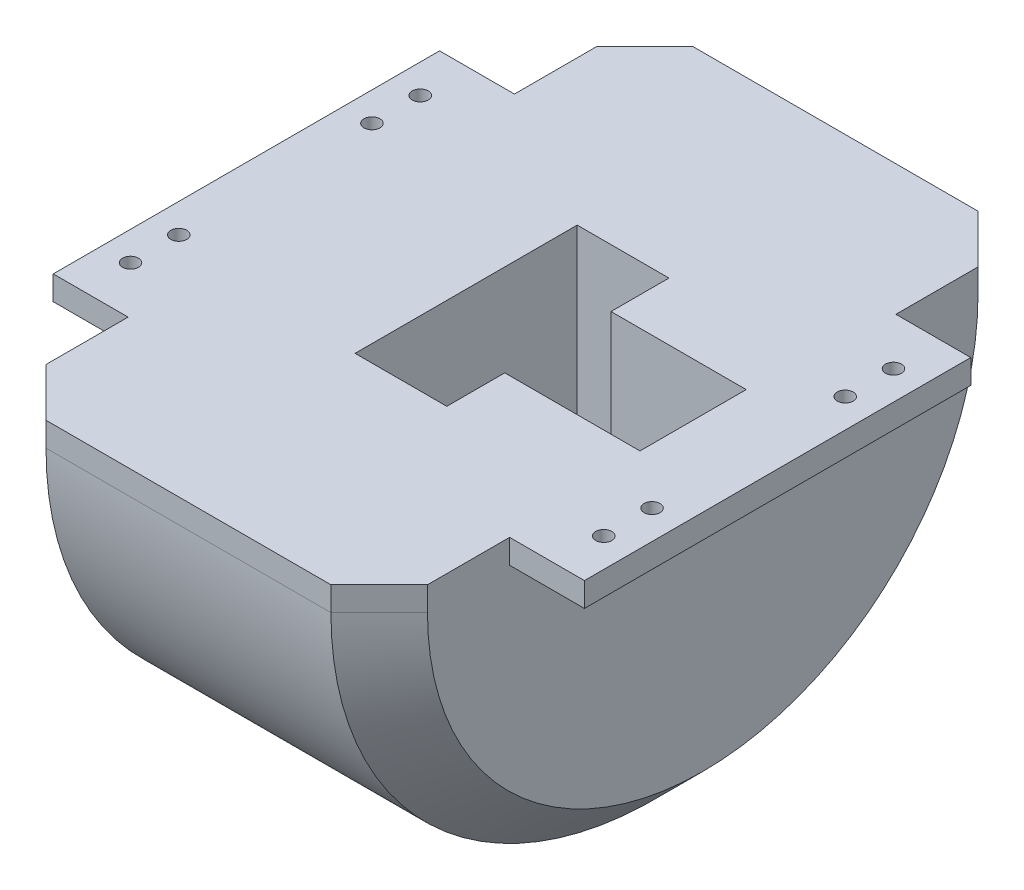
ISO-10303-21;
HEADER;
FILE_DESCRIPTION(('STEP AP214'),'2;1');
FILE_NAME('part.step','',(''),(''),'','','');
FILE_SCHEMA(('AUTOMOTIVE_DESIGN { 1 0 10303 214 1 1 1 1 }'));
ENDSEC;
DATA;
#1=APPLICATION_CONTEXT('core data for automotive mechanical design processes');
#2=APPLICATION_PROTOCOL_DEFINITION('international standard','automotive_design',2000,#1);
#3=PRODUCT_CONTEXT('',#1,'mechanical');
#4=PRODUCT('Part','Part','',(#3));
#5=PRODUCT_RELATED_PRODUCT_CATEGORY('part','',(#4));
#6=PRODUCT_DEFINITION_FORMATION('','',#4);
#7=PRODUCT_DEFINITION_CONTEXT('part definition',#1,'design');
#8=PRODUCT_DEFINITION('design','',#6,#7);
#9=PRODUCT_DEFINITION_SHAPE('','',#8);
#10=(LENGTH_UNIT() NAMED_UNIT(*) SI_UNIT(.MILLI.,.METRE.));
#11=(NAMED_UNIT(*) PLANE_ANGLE_UNIT() SI_UNIT($,.RADIAN.));
#12=(NAMED_UNIT(*) SI_UNIT($,.STERADIAN.) SOLID_ANGLE_UNIT());
#13=UNCERTAINTY_MEASURE_WITH_UNIT(LENGTH_MEASURE(1.E-05),#10,'distance_accuracy_value','');
#14=(GEOMETRIC_REPRESENTATION_CONTEXT(3) GLOBAL_UNCERTAINTY_ASSIGNED_CONTEXT((#13)) GLOBAL_UNIT_ASSIGNED_CONTEXT((#10,
#11,#12)) REPRESENTATION_CONTEXT('',''));
#15=CARTESIAN_POINT('',(0.,0.,0.));
#16=DIRECTION('',(0.,0.,1.));
#17=DIRECTION('',(1.,0.,0.));
#18=AXIS2_PLACEMENT_3D('',#15,#16,#17);
#19=CARTESIAN_POINT('',(0.,0.,0.));
#20=DIRECTION('',(0.,1.,0.));
#21=DIRECTION('',(0.,0.,1.));
#22=AXIS2_PLACEMENT_3D('',#19,#20,#21);
#23=PLANE('',#22);
#24=CARTESIAN_POINT('',(48.9999999999999,0.,20.));
#25=DIRECTION('',(0.,1.,0.));
#26=DIRECTION('',(0.,0.,1.));
#27=AXIS2_PLACEMENT_3D('',#24,#25,#26);
#28=CIRCLE('',#27,1.65);
#29=CARTESIAN_POINT('',(48.9999999999999,0.,21.65));
#30=VERTEX_POINT('',#29);
#31=EDGE_CURVE('E370',#30,#30,#28,.T.);
#32=ORIENTED_EDGE('',*,*,#31,.T.);
#33=EDGE_LOOP('',(#32));
#34=FACE_BOUND('',#33,.T.);
#35=CARTESIAN_POINT('',(49.,0.,30.));
#36=DIRECTION('',(0.,1.,0.));
#37=DIRECTION('',(0.,0.,1.));
#38=AXIS2_PLACEMENT_3D('',#35,#36,#37);
#39=CIRCLE('',#38,1.65);
#40=CARTESIAN_POINT('',(49.,0.,31.65));
#41=VERTEX_POINT('',#40);
#42=EDGE_CURVE('E378',#41,#41,#39,.T.);
#43=ORIENTED_EDGE('',*,*,#42,.T.);
#44=EDGE_LOOP('',(#43));
#45=FACE_BOUND('',#44,.T.);
#46=CARTESIAN_POINT('',(49.,0.,-30.));
#47=DIRECTION('',(0.,1.,0.));
#48=DIRECTION('',(0.,0.,-1.));
#49=AXIS2_PLACEMENT_3D('',#46,#47,#48);
#50=CIRCLE('',#49,1.65);
#51=CARTESIAN_POINT('',(49.,0.,-31.65));
#52=VERTEX_POINT('',#51);
#53=EDGE_CURVE('E386',#52,#52,#50,.T.);
#54=ORIENTED_EDGE('',*,*,#53,.T.);
#55=EDGE_LOOP('',(#54));
#56=FACE_BOUND('',#55,.T.);
#57=CARTESIAN_POINT('',(48.9999999999999,0.,-20.));
#58=DIRECTION('',(0.,1.,0.));
#59=DIRECTION('',(0.,0.,-1.));
#60=AXIS2_PLACEMENT_3D('',#57,#58,#59);
#61=CIRCLE('',#60,1.65);
#62=CARTESIAN_POINT('',(48.9999999999999,0.,-21.65));
#63=VERTEX_POINT('',#62);
#64=EDGE_CURVE('E394',#63,#63,#61,.T.);
#65=ORIENTED_EDGE('',*,*,#64,.T.);
#66=EDGE_LOOP('',(#65));
#67=FACE_BOUND('',#66,.T.);
#68=DIRECTION('',(0.,0.,-1.));
#69=VECTOR('',#68,1.);
#70=CARTESIAN_POINT('',(39.5000000000001,0.,-67.));
#71=LINE('',#70,#69);
#72=CARTESIAN_POINT('',(39.5,0.,40.));
#73=VERTEX_POINT('',#72);
#74=CARTESIAN_POINT('',(39.5000000000001,0.,-40.));
#75=VERTEX_POINT('',#74);
#76=EDGE_CURVE('E263',#73,#75,#71,.T.);
#77=ORIENTED_EDGE('',*,*,#76,.T.);
#78=DIRECTION('',(-1.,0.,0.));
#79=VECTOR('',#78,1.);
#80=CARTESIAN_POINT('',(-55.,0.,-40.));
#81=LINE('',#80,#79);
#82=CARTESIAN_POINT('',(55.,0.,-40.));
#83=VERTEX_POINT('',#82);
#84=EDGE_CURVE('E445',#83,#75,#81,.T.);
#85=ORIENTED_EDGE('',*,*,#84,.F.);
#86=DIRECTION('',(0.,0.,-1.));
#87=VECTOR('',#86,1.);
#88=CARTESIAN_POINT('',(55.,0.,-40.));
#89=LINE('',#88,#87);
#90=CARTESIAN_POINT('',(55.,0.,40.));
#91=VERTEX_POINT('',#90);
#92=EDGE_CURVE('E418',#91,#83,#89,.T.);
#93=ORIENTED_EDGE('',*,*,#92,.F.);
#94=DIRECTION('',(1.,0.,0.));
#95=VECTOR('',#94,1.);
#96=CARTESIAN_POINT('',(-55.,0.,40.));
#97=LINE('',#96,#95);
#98=EDGE_CURVE('E452',#73,#91,#97,.T.);
#99=ORIENTED_EDGE('',*,*,#98,.F.);
#100=EDGE_LOOP('',(#77,#85,#93,#99));
#101=FACE_BOUND('',#100,.T.);
#102=ADVANCED_FACE('F47',(#34,#45,#56,#67,#101),#23,.F.);
#103=CARTESIAN_POINT('',(-55.,5.,40.));
#104=DIRECTION('',(0.,0.,-1.));
#105=DIRECTION('',(-1.,0.,0.));
#106=AXIS2_PLACEMENT_3D('',#103,#104,#105);
#107=PLANE('',#106);
#108=DIRECTION('',(0.,1.,0.));
#109=VECTOR('',#108,1.);
#110=CARTESIAN_POINT('',(39.5,0.,40.));
#111=LINE('',#110,#109);
#112=CARTESIAN_POINT('',(39.5,5.,40.));
#113=VERTEX_POINT('',#112);
#114=EDGE_CURVE('E266',#73,#113,#111,.T.);
#115=ORIENTED_EDGE('',*,*,#114,.F.);
#116=ORIENTED_EDGE('',*,*,#98,.T.);
#117=DIRECTION('',(0.,-1.,0.));
#118=VECTOR('',#117,1.);
#119=CARTESIAN_POINT('',(55.,5.,40.));
#120=LINE('',#119,#118);
#121=CARTESIAN_POINT('',(55.,5.,40.));
#122=VERTEX_POINT('',#121);
#123=EDGE_CURVE('E440',#122,#91,#120,.T.);
#124=ORIENTED_EDGE('',*,*,#123,.F.);
#125=DIRECTION('',(1.,0.,0.));
#126=VECTOR('',#125,1.);
#127=CARTESIAN_POINT('',(-55.,5.,40.));
#128=LINE('',#127,#126);
#129=EDGE_CURVE('E435',#113,#122,#128,.T.);
#130=ORIENTED_EDGE('',*,*,#129,.F.);
#131=EDGE_LOOP('',(#115,#116,#124,#130));
#132=FACE_BOUND('',#131,.T.);
#133=ADVANCED_FACE('F597',(#132),#107,.F.);
#134=CARTESIAN_POINT('',(-55.,5.,-40.));
#135=DIRECTION('',(0.,0.,1.));
#136=DIRECTION('',(1.,0.,0.));
#137=AXIS2_PLACEMENT_3D('',#134,#135,#136);
#138=PLANE('',#137);
#139=DIRECTION('',(0.,1.,0.));
#140=VECTOR('',#139,1.);
#141=CARTESIAN_POINT('',(-39.5,0.,-40.));
#142=LINE('',#141,#140);
#143=CARTESIAN_POINT('',(-39.5,0.,-40.));
#144=VERTEX_POINT('',#143);
#145=CARTESIAN_POINT('',(-39.5,5.,-40.));
#146=VERTEX_POINT('',#145);
#147=EDGE_CURVE('E296',#144,#146,#142,.T.);
#148=ORIENTED_EDGE('',*,*,#147,.F.);
#149=CARTESIAN_POINT('',(-55.,0.,-40.));
#150=VERTEX_POINT('',#149);
#151=EDGE_CURVE('E444',#144,#150,#81,.T.);
#152=ORIENTED_EDGE('',*,*,#151,.T.);
#153=DIRECTION('',(0.,-1.,0.));
#154=VECTOR('',#153,1.);
#155=CARTESIAN_POINT('',(-55.,5.,-40.));
#156=LINE('',#155,#154);
#157=CARTESIAN_POINT('',(-55.,5.,-40.));
#158=VERTEX_POINT('',#157);
#159=EDGE_CURVE('E463',#158,#150,#156,.T.);
#160=ORIENTED_EDGE('',*,*,#159,.F.);
#161=DIRECTION('',(-1.,0.,0.));
#162=VECTOR('',#161,1.);
#163=CARTESIAN_POINT('',(-55.,5.,-40.));
#164=LINE('',#163,#162);
#165=EDGE_CURVE('E426',#146,#158,#164,.T.);
#166=ORIENTED_EDGE('',*,*,#165,.F.);
#167=EDGE_LOOP('',(#148,#152,#160,#166));
#168=FACE_BOUND('',#167,.T.);
#169=ADVANCED_FACE('F550',(#168),#138,.F.);
#170=CARTESIAN_POINT('',(0.,5.,0.));
#171=DIRECTION('',(0.,1.,0.));
#172=DIRECTION('',(0.,0.,1.));
#173=AXIS2_PLACEMENT_3D('',#170,#171,#172);
#174=PLANE('',#173);
#175=CARTESIAN_POINT('',(-49.,5.,30.));
#176=DIRECTION('',(0.,1.,0.));
#177=DIRECTION('',(0.,0.,-1.));
#178=AXIS2_PLACEMENT_3D('',#175,#176,#177);
#179=CIRCLE('',#178,1.65);
#180=CARTESIAN_POINT('',(-49.,5.,28.35));
#181=VERTEX_POINT('',#180);
#182=EDGE_CURVE('E366',#181,#181,#179,.T.);
#183=ORIENTED_EDGE('',*,*,#182,.F.);
#184=EDGE_LOOP('',(#183));
#185=FACE_BOUND('',#184,.T.);
#186=CARTESIAN_POINT('',(49.,5.,30.));
#187=DIRECTION('',(0.,1.,0.));
#188=DIRECTION('',(0.,0.,1.));
#189=AXIS2_PLACEMENT_3D('',#186,#187,#188);
#190=CIRCLE('',#189,1.65);
#191=CARTESIAN_POINT('',(49.,5.,31.65));
#192=VERTEX_POINT('',#191);
#193=EDGE_CURVE('E382',#192,#192,#190,.T.);
#194=ORIENTED_EDGE('',*,*,#193,.F.);
#195=EDGE_LOOP('',(#194));
#196=FACE_BOUND('',#195,.T.);
#197=CARTESIAN_POINT('',(48.9999999999999,5.,-20.));
#198=DIRECTION('',(0.,1.,0.));
#199=DIRECTION('',(0.,0.,-1.));
#200=AXIS2_PLACEMENT_3D('',#197,#198,#199);
#201=CIRCLE('',#200,1.65);
#202=CARTESIAN_POINT('',(48.9999999999999,5.,-21.65));
#203=VERTEX_POINT('',#202);
#204=EDGE_CURVE('E398',#203,#203,#201,.T.);
#205=ORIENTED_EDGE('',*,*,#204,.F.);
#206=EDGE_LOOP('',(#205));
#207=FACE_BOUND('',#206,.T.);
#208=CARTESIAN_POINT('',(-49.,5.,-30.));
#209=DIRECTION('',(0.,1.,0.));
#210=DIRECTION('',(0.,0.,1.));
#211=AXIS2_PLACEMENT_3D('',#208,#209,#210);
#212=CIRCLE('',#211,1.65);
#213=CARTESIAN_POINT('',(-49.,5.,-28.35));
#214=VERTEX_POINT('',#213);
#215=EDGE_CURVE('E414',#214,#214,#212,.T.);
#216=ORIENTED_EDGE('',*,*,#215,.F.);
#217=EDGE_LOOP('',(#216));
#218=FACE_BOUND('',#217,.T.);
#219=DIRECTION('',(0.,0.,-1.));
#220=VECTOR('',#219,1.);
#221=CARTESIAN_POINT('',(39.5,5.,-40.));
#222=LINE('',#221,#220);
#223=CARTESIAN_POINT('',(39.5,5.,-40.));
#224=VERTEX_POINT('',#223);
#225=CARTESIAN_POINT('',(39.5,5.,-57.));
#226=VERTEX_POINT('',#225);
#227=EDGE_CURVE('E300',#224,#226,#222,.T.);
#228=ORIENTED_EDGE('',*,*,#227,.T.);
#229=DIRECTION('',(0.707106781186547,0.,0.707106781186548));
#230=VECTOR('',#229,1.);
#231=CARTESIAN_POINT('',(48.25,5.,-48.2499999999999));
#232=LINE('',#231,#230);
#233=CARTESIAN_POINT('',(29.4999999999999,5.,-67.));
#234=VERTEX_POINT('',#233);
#235=EDGE_CURVE('E490',#226,#234,#232,.F.);
#236=ORIENTED_EDGE('',*,*,#235,.T.);
#237=DIRECTION('',(-1.,0.,0.));
#238=VECTOR('',#237,1.);
#239=CARTESIAN_POINT('',(-39.5,5.,-67.));
#240=LINE('',#239,#238);
#241=CARTESIAN_POINT('',(-29.5,5.,-67.));
#242=VERTEX_POINT('',#241);
#243=EDGE_CURVE('E297',#234,#242,#240,.T.);
#244=ORIENTED_EDGE('',*,*,#243,.T.);
#245=DIRECTION('',(0.707106781186549,0.,-0.707106781186546));
#246=VECTOR('',#245,1.);
#247=CARTESIAN_POINT('',(-48.2499999999999,5.,-48.2500000000002));
#248=LINE('',#247,#246);
#249=CARTESIAN_POINT('',(-39.5,5.,-57.));
#250=VERTEX_POINT('',#249);
#251=EDGE_CURVE('E484',#242,#250,#248,.F.);
#252=ORIENTED_EDGE('',*,*,#251,.T.);
#253=DIRECTION('',(0.,0.,1.));
#254=VECTOR('',#253,1.);
#255=CARTESIAN_POINT('',(-39.5,5.,-40.));
#256=LINE('',#255,#254);
#257=EDGE_CURVE('E288',#250,#146,#256,.T.);
#258=ORIENTED_EDGE('',*,*,#257,.T.);
#259=ORIENTED_EDGE('',*,*,#165,.T.);
#260=DIRECTION('',(0.,0.,1.));
#261=VECTOR('',#260,1.);
#262=CARTESIAN_POINT('',(-55.,5.,-40.));
#263=LINE('',#262,#261);
#264=CARTESIAN_POINT('',(-55.,5.,40.));
#265=VERTEX_POINT('',#264);
#266=EDGE_CURVE('E432',#158,#265,#263,.T.);
#267=ORIENTED_EDGE('',*,*,#266,.T.);
#268=CARTESIAN_POINT('',(-39.5,5.,40.));
#269=VERTEX_POINT('',#268);
#270=EDGE_CURVE('E436',#265,#269,#128,.T.);
#271=ORIENTED_EDGE('',*,*,#270,.T.);
#272=DIRECTION('',(0.,0.,1.));
#273=VECTOR('',#272,1.);
#274=CARTESIAN_POINT('',(-39.5,5.,40.));
#275=LINE('',#274,#273);
#276=CARTESIAN_POINT('',(-39.5,5.,57.0000000000001));
#277=VERTEX_POINT('',#276);
#278=EDGE_CURVE('E284',#269,#277,#275,.T.);
#279=ORIENTED_EDGE('',*,*,#278,.T.);
#280=DIRECTION('',(-0.70710678118655,0.,-0.707106781186545));
#281=VECTOR('',#280,1.);
#282=CARTESIAN_POINT('',(-48.2499999999999,5.,48.2500000000002));
#283=LINE('',#282,#281);
#284=CARTESIAN_POINT('',(-29.5,5.,67.));
#285=VERTEX_POINT('',#284);
#286=EDGE_CURVE('E481',#277,#285,#283,.F.);
#287=ORIENTED_EDGE('',*,*,#286,.T.);
#288=DIRECTION('',(1.,0.,0.));
#289=VECTOR('',#288,1.);
#290=CARTESIAN_POINT('',(-39.5,5.,67.));
#291=LINE('',#290,#289);
#292=CARTESIAN_POINT('',(29.5000000000001,5.,67.));
#293=VERTEX_POINT('',#292);
#294=EDGE_CURVE('E280',#285,#293,#291,.T.);
#295=ORIENTED_EDGE('',*,*,#294,.T.);
#296=DIRECTION('',(-0.707106781186546,0.,0.707106781186549));
#297=VECTOR('',#296,1.);
#298=CARTESIAN_POINT('',(48.2500000000001,5.,48.2499999999999));
#299=LINE('',#298,#297);
#300=CARTESIAN_POINT('',(39.5,5.,56.9999999999999));
#301=VERTEX_POINT('',#300);
#302=EDGE_CURVE('E487',#293,#301,#299,.F.);
#303=ORIENTED_EDGE('',*,*,#302,.T.);
#304=DIRECTION('',(0.,0.,-1.));
#305=VECTOR('',#304,1.);
#306=CARTESIAN_POINT('',(39.5,5.,40.));
#307=LINE('',#306,#305);
#308=EDGE_CURVE('E277',#301,#113,#307,.T.);
#309=ORIENTED_EDGE('',*,*,#308,.T.);
#310=ORIENTED_EDGE('',*,*,#129,.T.);
#311=DIRECTION('',(0.,0.,-1.));
#312=VECTOR('',#311,1.);
#313=CARTESIAN_POINT('',(55.,5.,-40.));
#314=LINE('',#313,#312);
#315=CARTESIAN_POINT('',(55.,5.,-40.));
#316=VERTEX_POINT('',#315);
#317=EDGE_CURVE('E422',#122,#316,#314,.T.);
#318=ORIENTED_EDGE('',*,*,#317,.T.);
#319=EDGE_CURVE('E428',#316,#224,#164,.T.);
#320=ORIENTED_EDGE('',*,*,#319,.T.);
#321=EDGE_LOOP('',(#228,#236,#244,#252,#258,#259,#267,#271,#279,#287,#295,#303,#309,#310,#318,#320));
#322=FACE_BOUND('',#321,.T.);
#323=CARTESIAN_POINT('',(-48.9999999999999,5.,-20.));
#324=DIRECTION('',(0.,1.,0.));
#325=DIRECTION('',(0.,0.,1.));
#326=AXIS2_PLACEMENT_3D('',#323,#324,#325);
#327=CIRCLE('',#326,1.65);
#328=CARTESIAN_POINT('',(-48.9999999999999,5.,-18.35));
#329=VERTEX_POINT('',#328);
#330=EDGE_CURVE('E406',#329,#329,#327,.T.);
#331=ORIENTED_EDGE('',*,*,#330,.F.);
#332=EDGE_LOOP('',(#331));
#333=FACE_BOUND('',#332,.T.);
#334=CARTESIAN_POINT('',(49.,5.,-30.));
#335=DIRECTION('',(0.,1.,0.));
#336=DIRECTION('',(0.,0.,-1.));
#337=AXIS2_PLACEMENT_3D('',#334,#335,#336);
#338=CIRCLE('',#337,1.65);
#339=CARTESIAN_POINT('',(49.,5.,-31.65));
#340=VERTEX_POINT('',#339);
#341=EDGE_CURVE('E390',#340,#340,#338,.T.);
#342=ORIENTED_EDGE('',*,*,#341,.F.);
#343=EDGE_LOOP('',(#342));
#344=FACE_BOUND('',#343,.T.);
#345=CARTESIAN_POINT('',(48.9999999999999,5.,20.));
#346=DIRECTION('',(0.,1.,0.));
#347=DIRECTION('',(0.,0.,1.));
#348=AXIS2_PLACEMENT_3D('',#345,#346,#347);
#349=CIRCLE('',#348,1.65);
#350=CARTESIAN_POINT('',(48.9999999999999,5.,21.65));
#351=VERTEX_POINT('',#350);
#352=EDGE_CURVE('E374',#351,#351,#349,.T.);
#353=ORIENTED_EDGE('',*,*,#352,.F.);
#354=EDGE_LOOP('',(#353));
#355=FACE_BOUND('',#354,.T.);
#356=CARTESIAN_POINT('',(-48.9999999999999,5.,20.));
#357=DIRECTION('',(0.,1.,0.));
#358=DIRECTION('',(0.,0.,-1.));
#359=AXIS2_PLACEMENT_3D('',#356,#357,#358);
#360=CIRCLE('',#359,1.65);
#361=CARTESIAN_POINT('',(-48.9999999999999,5.,18.35));
#362=VERTEX_POINT('',#361);
#363=EDGE_CURVE('E358',#362,#362,#360,.T.);
#364=ORIENTED_EDGE('',*,*,#363,.F.);
#365=EDGE_LOOP('',(#364));
#366=FACE_BOUND('',#365,.T.);
#367=DIRECTION('',(0.,0.,-1.));
#368=VECTOR('',#367,1.);
#369=CARTESIAN_POINT('',(9.49999999999999,5.,11.));
#370=LINE('',#369,#368);
#371=CARTESIAN_POINT('',(9.50000000000001,5.,23.));
#372=VERTEX_POINT('',#371);
#373=CARTESIAN_POINT('',(9.49999999999999,5.,11.));
#374=VERTEX_POINT('',#373);
#375=EDGE_CURVE('E317',#372,#374,#370,.T.);
#376=ORIENTED_EDGE('',*,*,#375,.F.);
#377=DIRECTION('',(1.,0.,0.));
#378=VECTOR('',#377,1.);
#379=CARTESIAN_POINT('',(-9.49999999999999,5.,23.));
#380=LINE('',#379,#378);
#381=CARTESIAN_POINT('',(-9.49999999999999,5.,23.));
#382=VERTEX_POINT('',#381);
#383=EDGE_CURVE('E311',#382,#372,#380,.T.);
#384=ORIENTED_EDGE('',*,*,#383,.F.);
#385=DIRECTION('',(0.,0.,1.));
#386=VECTOR('',#385,1.);
#387=CARTESIAN_POINT('',(-9.5,5.,-23.));
#388=LINE('',#387,#386);
#389=CARTESIAN_POINT('',(-9.5,5.,-23.));
#390=VERTEX_POINT('',#389);
#391=EDGE_CURVE('E335',#390,#382,#388,.T.);
#392=ORIENTED_EDGE('',*,*,#391,.F.);
#393=DIRECTION('',(-1.,0.,0.));
#394=VECTOR('',#393,1.);
#395=CARTESIAN_POINT('',(-9.5,5.,-23.));
#396=LINE('',#395,#394);
#397=CARTESIAN_POINT('',(9.5,5.,-23.));
#398=VERTEX_POINT('',#397);
#399=EDGE_CURVE('E331',#398,#390,#396,.T.);
#400=ORIENTED_EDGE('',*,*,#399,.F.);
#401=DIRECTION('',(0.,0.,-1.));
#402=VECTOR('',#401,1.);
#403=CARTESIAN_POINT('',(9.5,5.,-23.));
#404=LINE('',#403,#402);
#405=CARTESIAN_POINT('',(9.49999999999999,5.,-11.));
#406=VERTEX_POINT('',#405);
#407=EDGE_CURVE('E328',#406,#398,#404,.T.);
#408=ORIENTED_EDGE('',*,*,#407,.F.);
#409=DIRECTION('',(-1.,0.,0.));
#410=VECTOR('',#409,1.);
#411=CARTESIAN_POINT('',(9.49999999999999,5.,-11.));
#412=LINE('',#411,#410);
#413=CARTESIAN_POINT('',(37.5,5.,-11.));
#414=VERTEX_POINT('',#413);
#415=EDGE_CURVE('E217',#414,#406,#412,.T.);
#416=ORIENTED_EDGE('',*,*,#415,.F.);
#417=DIRECTION('',(0.,0.,-1.));
#418=VECTOR('',#417,1.);
#419=CARTESIAN_POINT('',(37.5,5.,-11.));
#420=LINE('',#419,#418);
#421=CARTESIAN_POINT('',(37.5,5.,11.));
#422=VERTEX_POINT('',#421);
#423=EDGE_CURVE('E323',#422,#414,#420,.T.);
#424=ORIENTED_EDGE('',*,*,#423,.F.);
#425=DIRECTION('',(1.,0.,0.));
#426=VECTOR('',#425,1.);
#427=CARTESIAN_POINT('',(9.49999999999999,5.,11.));
#428=LINE('',#427,#426);
#429=EDGE_CURVE('E320',#374,#422,#428,.T.);
#430=ORIENTED_EDGE('',*,*,#429,.F.);
#431=EDGE_LOOP('',(#376,#384,#392,#400,#408,#416,#424,#430));
#432=FACE_BOUND('',#431,.T.);
#433=ADVANCED_FACE('F536',(#185,#196,#207,#218,#322,#333,#344,#355,#366,#432),#174,.T.);
#434=CARTESIAN_POINT('',(-48.9999999999999,0.,20.));
#435=DIRECTION('',(0.,1.,0.));
#436=DIRECTION('',(0.,0.,-1.));
#437=AXIS2_PLACEMENT_3D('',#434,#435,#436);
#438=CIRCLE('',#437,1.65);
#439=CARTESIAN_POINT('',(-48.9999999999999,0.,18.35));
#440=VERTEX_POINT('',#439);
#441=EDGE_CURVE('E357',#440,#440,#438,.T.);
#442=ORIENTED_EDGE('',*,*,#441,.T.);
#443=EDGE_LOOP('',(#442));
#444=FACE_BOUND('',#443,.T.);
#445=CARTESIAN_POINT('',(-49.,0.,30.));
#446=DIRECTION('',(0.,1.,0.));
#447=DIRECTION('',(0.,0.,-1.));
#448=AXIS2_PLACEMENT_3D('',#445,#446,#447);
#449=CIRCLE('',#448,1.65);
#450=CARTESIAN_POINT('',(-49.,0.,28.35));
#451=VERTEX_POINT('',#450);
#452=EDGE_CURVE('E362',#451,#451,#449,.T.);
#453=ORIENTED_EDGE('',*,*,#452,.T.);
#454=EDGE_LOOP('',(#453));
#455=FACE_BOUND('',#454,.T.);
#456=CARTESIAN_POINT('',(-48.9999999999999,0.,-20.));
#457=DIRECTION('',(0.,1.,0.));
#458=DIRECTION('',(0.,0.,1.));
#459=AXIS2_PLACEMENT_3D('',#456,#457,#458);
#460=CIRCLE('',#459,1.65);
#461=CARTESIAN_POINT('',(-48.9999999999999,0.,-18.35));
#462=VERTEX_POINT('',#461);
#463=EDGE_CURVE('E402',#462,#462,#460,.T.);
#464=ORIENTED_EDGE('',*,*,#463,.T.);
#465=EDGE_LOOP('',(#464));
#466=FACE_BOUND('',#465,.T.);
#467=CARTESIAN_POINT('',(-49.,0.,-30.));
#468=DIRECTION('',(0.,1.,0.));
#469=DIRECTION('',(0.,0.,1.));
#470=AXIS2_PLACEMENT_3D('',#467,#468,#469);
#471=CIRCLE('',#470,1.65);
#472=CARTESIAN_POINT('',(-49.,0.,-28.35));
#473=VERTEX_POINT('',#472);
#474=EDGE_CURVE('E410',#473,#473,#471,.T.);
#475=ORIENTED_EDGE('',*,*,#474,.T.);
#476=EDGE_LOOP('',(#475));
#477=FACE_BOUND('',#476,.T.);
#478=ORIENTED_EDGE('',*,*,#151,.F.);
#479=DIRECTION('',(0.,0.,-1.));
#480=VECTOR('',#479,1.);
#481=CARTESIAN_POINT('',(-39.5,0.,-67.));
#482=LINE('',#481,#480);
#483=CARTESIAN_POINT('',(-39.5,0.,40.));
#484=VERTEX_POINT('',#483);
#485=EDGE_CURVE('E262',#484,#144,#482,.T.);
#486=ORIENTED_EDGE('',*,*,#485,.F.);
#487=CARTESIAN_POINT('',(-55.,0.,40.));
#488=VERTEX_POINT('',#487);
#489=EDGE_CURVE('E427',#488,#484,#97,.T.);
#490=ORIENTED_EDGE('',*,*,#489,.F.);
#491=DIRECTION('',(0.,0.,1.));
#492=VECTOR('',#491,1.);
#493=CARTESIAN_POINT('',(-55.,0.,-40.));
#494=LINE('',#493,#492);
#495=EDGE_CURVE('E449',#150,#488,#494,.T.);
#496=ORIENTED_EDGE('',*,*,#495,.F.);
#497=EDGE_LOOP('',(#478,#486,#490,#496));
#498=FACE_BOUND('',#497,.T.);
#499=ADVANCED_FACE('F553',(#444,#455,#466,#477,#498),#23,.F.);
#500=CARTESIAN_POINT('',(55.,5.,-40.));
#501=DIRECTION('',(-1.,0.,0.));
#502=DIRECTION('',(0.,0.,1.));
#503=AXIS2_PLACEMENT_3D('',#500,#501,#502);
#504=PLANE('',#503);
#505=ORIENTED_EDGE('',*,*,#92,.T.);
#506=DIRECTION('',(0.,-1.,0.));
#507=VECTOR('',#506,1.);
#508=CARTESIAN_POINT('',(55.,5.,-40.));
#509=LINE('',#508,#507);
#510=EDGE_CURVE('E467',#316,#83,#509,.T.);
#511=ORIENTED_EDGE('',*,*,#510,.F.);
#512=ORIENTED_EDGE('',*,*,#317,.F.);
#513=ORIENTED_EDGE('',*,*,#123,.T.);
#514=EDGE_LOOP('',(#505,#511,#512,#513));
#515=FACE_BOUND('',#514,.T.);
#516=ADVANCED_FACE('F608',(#515),#504,.F.);
#517=ORIENTED_EDGE('',*,*,#84,.T.);
#518=DIRECTION('',(0.,1.,0.));
#519=VECTOR('',#518,1.);
#520=CARTESIAN_POINT('',(39.5,0.,-40.));
#521=LINE('',#520,#519);
#522=EDGE_CURVE('E307',#75,#224,#521,.T.);
#523=ORIENTED_EDGE('',*,*,#522,.T.);
#524=ORIENTED_EDGE('',*,*,#319,.F.);
#525=ORIENTED_EDGE('',*,*,#510,.T.);
#526=EDGE_LOOP('',(#517,#523,#524,#525));
#527=FACE_BOUND('',#526,.T.);
#528=ADVANCED_FACE('F615',(#527),#138,.F.);
#529=CARTESIAN_POINT('',(-55.,5.,-40.));
#530=DIRECTION('',(1.,0.,0.));
#531=DIRECTION('',(0.,0.,-1.));
#532=AXIS2_PLACEMENT_3D('',#529,#530,#531);
#533=PLANE('',#532);
#534=ORIENTED_EDGE('',*,*,#495,.T.);
#535=DIRECTION('',(0.,-1.,0.));
#536=VECTOR('',#535,1.);
#537=CARTESIAN_POINT('',(-55.,5.,40.));
#538=LINE('',#537,#536);
#539=EDGE_CURVE('E459',#265,#488,#538,.T.);
#540=ORIENTED_EDGE('',*,*,#539,.F.);
#541=ORIENTED_EDGE('',*,*,#266,.F.);
#542=ORIENTED_EDGE('',*,*,#159,.T.);
#543=EDGE_LOOP('',(#534,#540,#541,#542));
#544=FACE_BOUND('',#543,.T.);
#545=ADVANCED_FACE('F640',(#544),#533,.F.);
#546=ORIENTED_EDGE('',*,*,#489,.T.);
#547=DIRECTION('',(0.,1.,0.));
#548=VECTOR('',#547,1.);
#549=CARTESIAN_POINT('',(-39.5,0.,40.));
#550=LINE('',#549,#548);
#551=EDGE_CURVE('E269',#484,#269,#550,.T.);
#552=ORIENTED_EDGE('',*,*,#551,.T.);
#553=ORIENTED_EDGE('',*,*,#270,.F.);
#554=ORIENTED_EDGE('',*,*,#539,.T.);
#555=EDGE_LOOP('',(#546,#552,#553,#554));
#556=FACE_BOUND('',#555,.T.);
#557=ADVANCED_FACE('F543',(#556),#107,.F.);
#558=CARTESIAN_POINT('',(-49.,5.,-30.));
#559=DIRECTION('',(0.,-1.,0.));
#560=DIRECTION('',(0.,0.,-1.));
#561=AXIS2_PLACEMENT_3D('',#558,#559,#560);
#562=CYLINDRICAL_SURFACE('',#561,1.65);
#563=ORIENTED_EDGE('',*,*,#215,.T.);
#564=EDGE_LOOP('',(#563));
#565=FACE_BOUND('',#564,.T.);
#566=ORIENTED_EDGE('',*,*,#474,.F.);
#567=EDGE_LOOP('',(#566));
#568=FACE_BOUND('',#567,.T.);
#569=ADVANCED_FACE('F628',(#565,#568),#562,.F.);
#570=CARTESIAN_POINT('',(-48.9999999999999,5.,-20.));
#571=DIRECTION('',(0.,-1.,0.));
#572=DIRECTION('',(0.,0.,-1.));
#573=AXIS2_PLACEMENT_3D('',#570,#571,#572);
#574=CYLINDRICAL_SURFACE('',#573,1.65);
#575=ORIENTED_EDGE('',*,*,#330,.T.);
#576=EDGE_LOOP('',(#575));
#577=FACE_BOUND('',#576,.T.);
#578=ORIENTED_EDGE('',*,*,#463,.F.);
#579=EDGE_LOOP('',(#578));
#580=FACE_BOUND('',#579,.T.);
#581=ADVANCED_FACE('F630',(#577,#580),#574,.F.);
#582=CARTESIAN_POINT('',(48.9999999999999,5.,-20.));
#583=DIRECTION('',(0.,-1.,0.));
#584=DIRECTION('',(0.,0.,-1.));
#585=AXIS2_PLACEMENT_3D('',#582,#583,#584);
#586=CYLINDRICAL_SURFACE('',#585,1.65);
#587=ORIENTED_EDGE('',*,*,#204,.T.);
#588=EDGE_LOOP('',(#587));
#589=FACE_BOUND('',#588,.T.);
#590=ORIENTED_EDGE('',*,*,#64,.F.);
#591=EDGE_LOOP('',(#590));
#592=FACE_BOUND('',#591,.T.);
#593=ADVANCED_FACE('F637',(#589,#592),#586,.F.);
#594=CARTESIAN_POINT('',(49.,5.,-30.));
#595=DIRECTION('',(0.,-1.,0.));
#596=DIRECTION('',(0.,0.,-1.));
#597=AXIS2_PLACEMENT_3D('',#594,#595,#596);
#598=CYLINDRICAL_SURFACE('',#597,1.65);
#599=ORIENTED_EDGE('',*,*,#341,.T.);
#600=EDGE_LOOP('',(#599));
#601=FACE_BOUND('',#600,.T.);
#602=ORIENTED_EDGE('',*,*,#53,.F.);
#603=EDGE_LOOP('',(#602));
#604=FACE_BOUND('',#603,.T.);
#605=ADVANCED_FACE('F644',(#601,#604),#598,.F.);
#606=CARTESIAN_POINT('',(49.,5.,30.));
#607=DIRECTION('',(0.,-1.,0.));
#608=DIRECTION('',(0.,0.,-1.));
#609=AXIS2_PLACEMENT_3D('',#606,#607,#608);
#610=CYLINDRICAL_SURFACE('',#609,1.65);
#611=ORIENTED_EDGE('',*,*,#193,.T.);
#612=EDGE_LOOP('',(#611));
#613=FACE_BOUND('',#612,.T.);
#614=ORIENTED_EDGE('',*,*,#42,.F.);
#615=EDGE_LOOP('',(#614));
#616=FACE_BOUND('',#615,.T.);
#617=ADVANCED_FACE('F648',(#613,#616),#610,.F.);
#618=CARTESIAN_POINT('',(48.9999999999999,5.,20.));
#619=DIRECTION('',(0.,-1.,0.));
#620=DIRECTION('',(0.,0.,-1.));
#621=AXIS2_PLACEMENT_3D('',#618,#619,#620);
#622=CYLINDRICAL_SURFACE('',#621,1.65);
#623=ORIENTED_EDGE('',*,*,#352,.T.);
#624=EDGE_LOOP('',(#623));
#625=FACE_BOUND('',#624,.T.);
#626=ORIENTED_EDGE('',*,*,#31,.F.);
#627=EDGE_LOOP('',(#626));
#628=FACE_BOUND('',#627,.T.);
#629=ADVANCED_FACE('F652',(#625,#628),#622,.F.);
#630=CARTESIAN_POINT('',(-49.,5.,30.));
#631=DIRECTION('',(0.,-1.,0.));
#632=DIRECTION('',(0.,0.,-1.));
#633=AXIS2_PLACEMENT_3D('',#630,#631,#632);
#634=CYLINDRICAL_SURFACE('',#633,1.65);
#635=ORIENTED_EDGE('',*,*,#182,.T.);
#636=EDGE_LOOP('',(#635));
#637=FACE_BOUND('',#636,.T.);
#638=ORIENTED_EDGE('',*,*,#452,.F.);
#639=EDGE_LOOP('',(#638));
#640=FACE_BOUND('',#639,.T.);
#641=ADVANCED_FACE('F593',(#637,#640),#634,.F.);
#642=CARTESIAN_POINT('',(-48.9999999999999,5.,20.));
#643=DIRECTION('',(0.,-1.,0.));
#644=DIRECTION('',(0.,0.,-1.));
#645=AXIS2_PLACEMENT_3D('',#642,#643,#644);
#646=CYLINDRICAL_SURFACE('',#645,1.65);
#647=ORIENTED_EDGE('',*,*,#363,.T.);
#648=EDGE_LOOP('',(#647));
#649=FACE_BOUND('',#648,.T.);
#650=ORIENTED_EDGE('',*,*,#441,.F.);
#651=EDGE_LOOP('',(#650));
#652=FACE_BOUND('',#651,.T.);
#653=ADVANCED_FACE('F585',(#649,#652),#646,.F.);
#654=CARTESIAN_POINT('',(-9.49999999999999,5.,23.));
#655=DIRECTION('',(0.,0.,-1.));
#656=DIRECTION('',(-1.,0.,0.));
#657=AXIS2_PLACEMENT_3D('',#654,#655,#656);
#658=PLANE('',#657);
#659=DIRECTION('',(0.,-1.,0.));
#660=VECTOR('',#659,1.);
#661=CARTESIAN_POINT('',(9.50000000000001,5.,23.));
#662=LINE('',#661,#660);
#663=CARTESIAN_POINT('',(9.50000000000001,-55.5,23.));
#664=VERTEX_POINT('',#663);
#665=EDGE_CURVE('E354',#372,#664,#662,.T.);
#666=ORIENTED_EDGE('',*,*,#665,.T.);
#667=DIRECTION('',(1.,0.,0.));
#668=VECTOR('',#667,1.);
#669=CARTESIAN_POINT('',(0.,-55.5,23.));
#670=LINE('',#669,#668);
#671=CARTESIAN_POINT('',(-9.49999999999999,-55.5,23.));
#672=VERTEX_POINT('',#671);
#673=EDGE_CURVE('E253',#672,#664,#670,.T.);
#674=ORIENTED_EDGE('',*,*,#673,.F.);
#675=DIRECTION('',(0.,-1.,0.));
#676=VECTOR('',#675,1.);
#677=CARTESIAN_POINT('',(-9.49999999999999,5.,23.));
#678=LINE('',#677,#676);
#679=EDGE_CURVE('E338',#382,#672,#678,.T.);
#680=ORIENTED_EDGE('',*,*,#679,.F.);
#681=ORIENTED_EDGE('',*,*,#383,.T.);
#682=EDGE_LOOP('',(#666,#674,#680,#681));
#683=FACE_BOUND('',#682,.T.);
#684=ADVANCED_FACE('F583',(#683),#658,.T.);
#685=CARTESIAN_POINT('',(9.49999999999999,5.,11.));
#686=DIRECTION('',(-1.,0.,0.));
#687=DIRECTION('',(0.,0.,1.));
#688=AXIS2_PLACEMENT_3D('',#685,#686,#687);
#689=PLANE('',#688);
#690=DIRECTION('',(0.,-1.,0.));
#691=VECTOR('',#690,1.);
#692=CARTESIAN_POINT('',(9.49999999999999,5.,11.));
#693=LINE('',#692,#691);
#694=CARTESIAN_POINT('',(9.49999999999999,-55.5,11.));
#695=VERTEX_POINT('',#694);
#696=EDGE_CURVE('E351',#374,#695,#693,.T.);
#697=ORIENTED_EDGE('',*,*,#696,.T.);
#698=DIRECTION('',(0.,0.,-1.));
#699=VECTOR('',#698,1.);
#700=CARTESIAN_POINT('',(9.49999999999998,-55.5,0.));
#701=LINE('',#700,#699);
#702=EDGE_CURVE('E234',#664,#695,#701,.T.);
#703=ORIENTED_EDGE('',*,*,#702,.F.);
#704=ORIENTED_EDGE('',*,*,#665,.F.);
#705=ORIENTED_EDGE('',*,*,#375,.T.);
#706=EDGE_LOOP('',(#697,#703,#704,#705));
#707=FACE_BOUND('',#706,.T.);
#708=ADVANCED_FACE('F562',(#707),#689,.T.);
#709=CARTESIAN_POINT('',(9.49999999999999,5.,11.));
#710=DIRECTION('',(0.,0.,-1.));
#711=DIRECTION('',(-1.,0.,0.));
#712=AXIS2_PLACEMENT_3D('',#709,#710,#711);
#713=PLANE('',#712);
#714=DIRECTION('',(0.,-1.,0.));
#715=VECTOR('',#714,1.);
#716=CARTESIAN_POINT('',(37.5,5.,11.));
#717=LINE('',#716,#715);
#718=CARTESIAN_POINT('',(37.5,-55.5,11.));
#719=VERTEX_POINT('',#718);
#720=EDGE_CURVE('E348',#422,#719,#717,.T.);
#721=ORIENTED_EDGE('',*,*,#720,.T.);
#722=DIRECTION('',(1.,0.,0.));
#723=VECTOR('',#722,1.);
#724=CARTESIAN_POINT('',(0.,-55.5,11.));
#725=LINE('',#724,#723);
#726=EDGE_CURVE('E257',#695,#719,#725,.T.);
#727=ORIENTED_EDGE('',*,*,#726,.F.);
#728=ORIENTED_EDGE('',*,*,#696,.F.);
#729=ORIENTED_EDGE('',*,*,#429,.T.);
#730=EDGE_LOOP('',(#721,#727,#728,#729));
#731=FACE_BOUND('',#730,.T.);
#732=ADVANCED_FACE('F567',(#731),#713,.T.);
#733=CARTESIAN_POINT('',(37.5,5.,-11.));
#734=DIRECTION('',(-1.,0.,0.));
#735=DIRECTION('',(0.,0.,1.));
#736=AXIS2_PLACEMENT_3D('',#733,#734,#735);
#737=PLANE('',#736);
#738=DIRECTION('',(0.,-1.,0.));
#739=VECTOR('',#738,1.);
#740=CARTESIAN_POINT('',(37.5,5.,-11.));
#741=LINE('',#740,#739);
#742=CARTESIAN_POINT('',(37.5,-55.5,-11.));
#743=VERTEX_POINT('',#742);
#744=EDGE_CURVE('E221',#414,#743,#741,.T.);
#745=ORIENTED_EDGE('',*,*,#744,.T.);
#746=DIRECTION('',(0.,0.,-1.));
#747=VECTOR('',#746,1.);
#748=CARTESIAN_POINT('',(37.5,-55.5,0.));
#749=LINE('',#748,#747);
#750=EDGE_CURVE('E238',#719,#743,#749,.T.);
#751=ORIENTED_EDGE('',*,*,#750,.F.);
#752=ORIENTED_EDGE('',*,*,#720,.F.);
#753=ORIENTED_EDGE('',*,*,#423,.T.);
#754=EDGE_LOOP('',(#745,#751,#752,#753));
#755=FACE_BOUND('',#754,.T.);
#756=ADVANCED_FACE('F571',(#755),#737,.T.);
#757=CARTESIAN_POINT('',(9.49999999999999,5.,-11.));
#758=DIRECTION('',(0.,0.,1.));
#759=DIRECTION('',(1.,0.,0.));
#760=AXIS2_PLACEMENT_3D('',#757,#758,#759);
#761=PLANE('',#760);
#762=DIRECTION('',(0.,-1.,0.));
#763=VECTOR('',#762,1.);
#764=CARTESIAN_POINT('',(9.49999999999999,5.,-11.));
#765=LINE('',#764,#763);
#766=CARTESIAN_POINT('',(9.49999999999998,-55.5,-11.));
#767=VERTEX_POINT('',#766);
#768=EDGE_CURVE('E209',#406,#767,#765,.T.);
#769=ORIENTED_EDGE('',*,*,#768,.T.);
#770=DIRECTION('',(-1.,0.,0.));
#771=VECTOR('',#770,1.);
#772=CARTESIAN_POINT('',(0.,-55.5,-11.));
#773=LINE('',#772,#771);
#774=EDGE_CURVE('E214',#743,#767,#773,.T.);
#775=ORIENTED_EDGE('',*,*,#774,.F.);
#776=ORIENTED_EDGE('',*,*,#744,.F.);
#777=ORIENTED_EDGE('',*,*,#415,.T.);
#778=EDGE_LOOP('',(#769,#775,#776,#777));
#779=FACE_BOUND('',#778,.T.);
#780=ADVANCED_FACE('F211',(#779),#761,.T.);
#781=CARTESIAN_POINT('',(9.5,5.,-23.));
#782=DIRECTION('',(-1.,0.,0.));
#783=DIRECTION('',(0.,0.,1.));
#784=AXIS2_PLACEMENT_3D('',#781,#782,#783);
#785=PLANE('',#784);
#786=DIRECTION('',(0.,-1.,0.));
#787=VECTOR('',#786,1.);
#788=CARTESIAN_POINT('',(9.5,5.,-23.));
#789=LINE('',#788,#787);
#790=CARTESIAN_POINT('',(9.5,-55.5,-23.));
#791=VERTEX_POINT('',#790);
#792=EDGE_CURVE('E222',#398,#791,#789,.T.);
#793=ORIENTED_EDGE('',*,*,#792,.T.);
#794=EDGE_CURVE('E225',#767,#791,#701,.T.);
#795=ORIENTED_EDGE('',*,*,#794,.F.);
#796=ORIENTED_EDGE('',*,*,#768,.F.);
#797=ORIENTED_EDGE('',*,*,#407,.T.);
#798=EDGE_LOOP('',(#793,#795,#796,#797));
#799=FACE_BOUND('',#798,.T.);
#800=ADVANCED_FACE('F226',(#799),#785,.T.);
#801=CARTESIAN_POINT('',(-9.5,5.,-23.));
#802=DIRECTION('',(0.,0.,1.));
#803=DIRECTION('',(1.,0.,0.));
#804=AXIS2_PLACEMENT_3D('',#801,#802,#803);
#805=PLANE('',#804);
#806=DIRECTION('',(0.,-1.,0.));
#807=VECTOR('',#806,1.);
#808=CARTESIAN_POINT('',(-9.5,5.,-23.));
#809=LINE('',#808,#807);
#810=CARTESIAN_POINT('',(-9.5,-55.5,-23.));
#811=VERTEX_POINT('',#810);
#812=EDGE_CURVE('E341',#390,#811,#809,.T.);
#813=ORIENTED_EDGE('',*,*,#812,.T.);
#814=DIRECTION('',(-1.,0.,0.));
#815=VECTOR('',#814,1.);
#816=CARTESIAN_POINT('',(0.,-55.5,-23.));
#817=LINE('',#816,#815);
#818=EDGE_CURVE('E232',#791,#811,#817,.T.);
#819=ORIENTED_EDGE('',*,*,#818,.F.);
#820=ORIENTED_EDGE('',*,*,#792,.F.);
#821=ORIENTED_EDGE('',*,*,#399,.T.);
#822=EDGE_LOOP('',(#813,#819,#820,#821));
#823=FACE_BOUND('',#822,.T.);
#824=ADVANCED_FACE('F576',(#823),#805,.T.);
#825=CARTESIAN_POINT('',(-9.5,5.,-23.));
#826=DIRECTION('',(1.,0.,0.));
#827=DIRECTION('',(0.,0.,-1.));
#828=AXIS2_PLACEMENT_3D('',#825,#826,#827);
#829=PLANE('',#828);
#830=ORIENTED_EDGE('',*,*,#679,.T.);
#831=DIRECTION('',(0.,0.,1.));
#832=VECTOR('',#831,1.);
#833=CARTESIAN_POINT('',(-9.49999999999999,-55.5,0.));
#834=LINE('',#833,#832);
#835=EDGE_CURVE('E249',#811,#672,#834,.T.);
#836=ORIENTED_EDGE('',*,*,#835,.F.);
#837=ORIENTED_EDGE('',*,*,#812,.F.);
#838=ORIENTED_EDGE('',*,*,#391,.T.);
#839=EDGE_LOOP('',(#830,#836,#837,#838));
#840=FACE_BOUND('',#839,.T.);
#841=ADVANCED_FACE('F579',(#840),#829,.T.);
#842=CARTESIAN_POINT('',(-39.5,0.,-40.));
#843=DIRECTION('',(-1.,0.,0.));
#844=DIRECTION('',(0.,0.,1.));
#845=AXIS2_PLACEMENT_3D('',#842,#843,#844);
#846=PLANE('',#845);
#847=ORIENTED_EDGE('',*,*,#257,.F.);
#848=DIRECTION('',(0.,-1.,0.));
#849=VECTOR('',#848,1.);
#850=CARTESIAN_POINT('',(-39.5,0.,-57.));
#851=LINE('',#850,#849);
#852=CARTESIAN_POINT('',(-39.5,0.,-57.));
#853=VERTEX_POINT('',#852);
#854=EDGE_CURVE('E11',#250,#853,#851,.T.);
#855=ORIENTED_EDGE('',*,*,#854,.T.);
#856=CARTESIAN_POINT('',(-39.5,0.,0.));
#857=DIRECTION('',(-1.,0.,0.));
#858=DIRECTION('',(0.,0.,1.));
#859=AXIS2_PLACEMENT_3D('',#856,#857,#858);
#860=CIRCLE('',#859,57.);
#861=CARTESIAN_POINT('',(-39.5,0.,57.));
#862=VERTEX_POINT('',#861);
#863=EDGE_CURVE('E65',#853,#862,#860,.T.);
#864=ORIENTED_EDGE('',*,*,#863,.T.);
#865=DIRECTION('',(0.,1.,0.));
#866=VECTOR('',#865,1.);
#867=CARTESIAN_POINT('',(-39.5,0.,57.0000000000001));
#868=LINE('',#867,#866);
#869=EDGE_CURVE('E58',#862,#277,#868,.T.);
#870=ORIENTED_EDGE('',*,*,#869,.T.);
#871=ORIENTED_EDGE('',*,*,#278,.F.);
#872=ORIENTED_EDGE('',*,*,#551,.F.);
#873=ORIENTED_EDGE('',*,*,#485,.T.);
#874=ORIENTED_EDGE('',*,*,#147,.T.);
#875=EDGE_LOOP('',(#847,#855,#864,#870,#871,#872,#873,#874));
#876=FACE_BOUND('',#875,.T.);
#877=ADVANCED_FACE('F533',(#876),#846,.T.);
#878=CARTESIAN_POINT('',(-39.5,0.,-67.));
#879=DIRECTION('',(0.,0.,-1.));
#880=DIRECTION('',(-1.,0.,0.));
#881=AXIS2_PLACEMENT_3D('',#878,#879,#880);
#882=PLANE('',#881);
#883=ORIENTED_EDGE('',*,*,#243,.F.);
#884=DIRECTION('',(0.,-1.,0.));
#885=VECTOR('',#884,1.);
#886=CARTESIAN_POINT('',(29.5,0.,-67.));
#887=LINE('',#886,#885);
#888=CARTESIAN_POINT('',(29.5,0.,-67.));
#889=VERTEX_POINT('',#888);
#890=EDGE_CURVE('E497',#234,#889,#887,.T.);
#891=ORIENTED_EDGE('',*,*,#890,.T.);
#892=DIRECTION('',(-1.,0.,0.));
#893=VECTOR('',#892,1.);
#894=CARTESIAN_POINT('',(-39.5,0.,-67.));
#895=LINE('',#894,#893);
#896=CARTESIAN_POINT('',(-29.5,0.,-67.));
#897=VERTEX_POINT('',#896);
#898=EDGE_CURVE('E292',#889,#897,#895,.T.);
#899=ORIENTED_EDGE('',*,*,#898,.T.);
#900=DIRECTION('',(0.,1.,0.));
#901=VECTOR('',#900,1.);
#902=CARTESIAN_POINT('',(-29.5,0.,-67.));
#903=LINE('',#902,#901);
#904=EDGE_CURVE('E493',#897,#242,#903,.T.);
#905=ORIENTED_EDGE('',*,*,#904,.T.);
#906=EDGE_LOOP('',(#883,#891,#899,#905));
#907=FACE_BOUND('',#906,.T.);
#908=ADVANCED_FACE('F704',(#907),#882,.T.);
#909=CARTESIAN_POINT('',(39.5,0.,-40.));
#910=DIRECTION('',(1.,0.,0.));
#911=DIRECTION('',(0.,0.,-1.));
#912=AXIS2_PLACEMENT_3D('',#909,#910,#911);
#913=PLANE('',#912);
#914=CARTESIAN_POINT('',(39.5000000000001,0.,0.));
#915=DIRECTION('',(1.,0.,0.));
#916=DIRECTION('',(0.,0.,-1.));
#917=AXIS2_PLACEMENT_3D('',#914,#915,#916);
#918=CIRCLE('',#917,57.);
#919=CARTESIAN_POINT('',(39.5000000000001,0.,57.));
#920=VERTEX_POINT('',#919);
#921=CARTESIAN_POINT('',(39.5,0.,-57.));
#922=VERTEX_POINT('',#921);
#923=EDGE_CURVE('E471',#920,#922,#918,.T.);
#924=ORIENTED_EDGE('',*,*,#923,.T.);
#925=DIRECTION('',(0.,1.,0.));
#926=VECTOR('',#925,1.);
#927=CARTESIAN_POINT('',(39.5,0.,-57.));
#928=LINE('',#927,#926);
#929=EDGE_CURVE('E477',#922,#226,#928,.T.);
#930=ORIENTED_EDGE('',*,*,#929,.T.);
#931=ORIENTED_EDGE('',*,*,#227,.F.);
#932=ORIENTED_EDGE('',*,*,#522,.F.);
#933=ORIENTED_EDGE('',*,*,#76,.F.);
#934=ORIENTED_EDGE('',*,*,#114,.T.);
#935=ORIENTED_EDGE('',*,*,#308,.F.);
#936=DIRECTION('',(0.,-1.,0.));
#937=VECTOR('',#936,1.);
#938=CARTESIAN_POINT('',(39.5000000000001,0.,56.9999999999999));
#939=LINE('',#938,#937);
#940=EDGE_CURVE('E474',#301,#920,#939,.T.);
#941=ORIENTED_EDGE('',*,*,#940,.T.);
#942=EDGE_LOOP('',(#924,#930,#931,#932,#933,#934,#935,#941));
#943=FACE_BOUND('',#942,.T.);
#944=ADVANCED_FACE('F678',(#943),#913,.T.);
#945=CARTESIAN_POINT('',(-39.5,0.,67.));
#946=DIRECTION('',(0.,0.,1.));
#947=DIRECTION('',(1.,0.,0.));
#948=AXIS2_PLACEMENT_3D('',#945,#946,#947);
#949=PLANE('',#948);
#950=DIRECTION('',(1.,0.,0.));
#951=VECTOR('',#950,1.);
#952=CARTESIAN_POINT('',(-39.5,0.,67.));
#953=LINE('',#952,#951);
#954=CARTESIAN_POINT('',(-29.5,0.,67.));
#955=VERTEX_POINT('',#954);
#956=CARTESIAN_POINT('',(29.5,0.,67.));
#957=VERTEX_POINT('',#956);
#958=EDGE_CURVE('E273',#955,#957,#953,.T.);
#959=ORIENTED_EDGE('',*,*,#958,.T.);
#960=DIRECTION('',(0.,1.,0.));
#961=VECTOR('',#960,1.);
#962=CARTESIAN_POINT('',(29.5000000000001,0.,67.));
#963=LINE('',#962,#961);
#964=EDGE_CURVE('E503',#957,#293,#963,.T.);
#965=ORIENTED_EDGE('',*,*,#964,.T.);
#966=ORIENTED_EDGE('',*,*,#294,.F.);
#967=DIRECTION('',(0.,-1.,0.));
#968=VECTOR('',#967,1.);
#969=CARTESIAN_POINT('',(-29.5,0.,67.));
#970=LINE('',#969,#968);
#971=EDGE_CURVE('E500',#285,#955,#970,.T.);
#972=ORIENTED_EDGE('',*,*,#971,.T.);
#973=EDGE_LOOP('',(#959,#965,#966,#972));
#974=FACE_BOUND('',#973,.T.);
#975=ADVANCED_FACE('F783',(#974),#949,.T.);
#976=CARTESIAN_POINT('',(39.5,0.,0.));
#977=DIRECTION('',(-1.,0.,0.));
#978=DIRECTION('',(0.,0.,1.));
#979=AXIS2_PLACEMENT_3D('',#976,#977,#978);
#980=CYLINDRICAL_SURFACE('',#979,67.);
#981=ORIENTED_EDGE('',*,*,#898,.F.);
#982=CARTESIAN_POINT('',(29.5000000000001,0.,0.));
#983=DIRECTION('',(1.,0.,0.));
#984=DIRECTION('',(0.,0.,-1.));
#985=AXIS2_PLACEMENT_3D('',#982,#983,#984);
#986=CIRCLE('',#985,67.);
#987=EDGE_CURVE('E509',#889,#957,#986,.F.);
#988=ORIENTED_EDGE('',*,*,#987,.T.);
#989=ORIENTED_EDGE('',*,*,#958,.F.);
#990=CARTESIAN_POINT('',(-29.5,0.,0.));
#991=DIRECTION('',(-1.,0.,0.));
#992=DIRECTION('',(0.,0.,1.));
#993=AXIS2_PLACEMENT_3D('',#990,#991,#992);
#994=CIRCLE('',#993,67.);
#995=EDGE_CURVE('E506',#955,#897,#994,.F.);
#996=ORIENTED_EDGE('',*,*,#995,.T.);
#997=EDGE_LOOP('',(#981,#988,#989,#996));
#998=FACE_BOUND('',#997,.T.);
#999=ADVANCED_FACE('F774',(#998),#980,.T.);
#1000=CARTESIAN_POINT('',(0.,-55.5,0.));
#1001=DIRECTION('',(0.,1.,0.));
#1002=DIRECTION('',(0.,0.,1.));
#1003=AXIS2_PLACEMENT_3D('',#1000,#1001,#1002);
#1004=PLANE('',#1003);
#1005=ORIENTED_EDGE('',*,*,#774,.T.);
#1006=ORIENTED_EDGE('',*,*,#794,.T.);
#1007=ORIENTED_EDGE('',*,*,#818,.T.);
#1008=ORIENTED_EDGE('',*,*,#835,.T.);
#1009=ORIENTED_EDGE('',*,*,#673,.T.);
#1010=ORIENTED_EDGE('',*,*,#702,.T.);
#1011=ORIENTED_EDGE('',*,*,#726,.T.);
#1012=ORIENTED_EDGE('',*,*,#750,.T.);
#1013=EDGE_LOOP('',(#1005,#1006,#1007,#1008,#1009,#1010,#1011,#1012));
#1014=FACE_BOUND('',#1013,.T.);
#1015=ADVANCED_FACE('F235',(#1014),#1004,.T.);
#1016=CARTESIAN_POINT('',(29.5000000000001,0.,67.));
#1017=DIRECTION('',(-0.707106781186549,0.,-0.707106781186546));
#1018=DIRECTION('',(0.,1.,0.));
#1019=AXIS2_PLACEMENT_3D('',#1016,#1017,#1018);
#1020=PLANE('',#1019);
#1021=ORIENTED_EDGE('',*,*,#302,.F.);
#1022=ORIENTED_EDGE('',*,*,#964,.F.);
#1023=DIRECTION('',(-0.707106781186546,0.,0.707106781186549));
#1024=VECTOR('',#1023,1.);
#1025=CARTESIAN_POINT('',(39.5000000000001,0.,56.9999999999999));
#1026=LINE('',#1025,#1024);
#1027=EDGE_CURVE('E240',#920,#957,#1026,.T.);
#1028=ORIENTED_EDGE('',*,*,#1027,.F.);
#1029=ORIENTED_EDGE('',*,*,#940,.F.);
#1030=EDGE_LOOP('',(#1021,#1022,#1028,#1029));
#1031=FACE_BOUND('',#1030,.T.);
#1032=ADVANCED_FACE('F692',(#1031),#1020,.F.);
#1033=CARTESIAN_POINT('',(29.5000000000001,0.,0.));
#1034=DIRECTION('',(-1.,0.,0.));
#1035=DIRECTION('',(0.,0.,1.));
#1036=AXIS2_PLACEMENT_3D('',#1033,#1034,#1035);
#1037=CONICAL_SURFACE('',#1036,67.,0.78539816339745);
#1038=ORIENTED_EDGE('',*,*,#1027,.T.);
#1039=ORIENTED_EDGE('',*,*,#987,.F.);
#1040=DIRECTION('',(-0.707106781186546,0.,-0.707106781186549));
#1041=VECTOR('',#1040,1.);
#1042=CARTESIAN_POINT('',(39.5,0.,-57.));
#1043=LINE('',#1042,#1041);
#1044=EDGE_CURVE('E244',#922,#889,#1043,.T.);
#1045=ORIENTED_EDGE('',*,*,#1044,.F.);
#1046=ORIENTED_EDGE('',*,*,#923,.F.);
#1047=EDGE_LOOP('',(#1038,#1039,#1045,#1046));
#1048=FACE_BOUND('',#1047,.T.);
#1049=ADVANCED_FACE('F698',(#1048),#1037,.T.);
#1050=CARTESIAN_POINT('',(39.5,0.,-57.));
#1051=DIRECTION('',(-0.707106781186548,0.,0.707106781186547));
#1052=DIRECTION('',(0.,1.,0.));
#1053=AXIS2_PLACEMENT_3D('',#1050,#1051,#1052);
#1054=PLANE('',#1053);
#1055=ORIENTED_EDGE('',*,*,#1044,.T.);
#1056=ORIENTED_EDGE('',*,*,#890,.F.);
#1057=ORIENTED_EDGE('',*,*,#235,.F.);
#1058=ORIENTED_EDGE('',*,*,#929,.F.);
#1059=EDGE_LOOP('',(#1055,#1056,#1057,#1058));
#1060=FACE_BOUND('',#1059,.T.);
#1061=ADVANCED_FACE('F706',(#1060),#1054,.F.);
#1062=CARTESIAN_POINT('',(-39.5,0.,57.0000000000001));
#1063=DIRECTION('',(0.707106781186545,0.,-0.70710678118655));
#1064=DIRECTION('',(0.,1.,0.));
#1065=AXIS2_PLACEMENT_3D('',#1062,#1063,#1064);
#1066=PLANE('',#1065);
#1067=ORIENTED_EDGE('',*,*,#286,.F.);
#1068=ORIENTED_EDGE('',*,*,#869,.F.);
#1069=DIRECTION('',(-0.70710678118655,0.,-0.707106781186545));
#1070=VECTOR('',#1069,1.);
#1071=CARTESIAN_POINT('',(-29.5,0.,67.));
#1072=LINE('',#1071,#1070);
#1073=EDGE_CURVE('E52',#955,#862,#1072,.T.);
#1074=ORIENTED_EDGE('',*,*,#1073,.F.);
#1075=ORIENTED_EDGE('',*,*,#971,.F.);
#1076=EDGE_LOOP('',(#1067,#1068,#1074,#1075));
#1077=FACE_BOUND('',#1076,.T.);
#1078=ADVANCED_FACE('F50',(#1077),#1066,.F.);
#1079=CARTESIAN_POINT('',(-39.5,0.,0.));
#1080=DIRECTION('',(1.,0.,0.));
#1081=DIRECTION('',(0.,0.,-1.));
#1082=AXIS2_PLACEMENT_3D('',#1079,#1080,#1081);
#1083=CONICAL_SURFACE('',#1082,57.,0.785398163397446);
#1084=ORIENTED_EDGE('',*,*,#1073,.T.);
#1085=ORIENTED_EDGE('',*,*,#863,.F.);
#1086=DIRECTION('',(-0.707106781186549,0.,0.707106781186546));
#1087=VECTOR('',#1086,1.);
#1088=CARTESIAN_POINT('',(-29.5,0.,-67.));
#1089=LINE('',#1088,#1087);
#1090=EDGE_CURVE('E518',#897,#853,#1089,.T.);
#1091=ORIENTED_EDGE('',*,*,#1090,.F.);
#1092=ORIENTED_EDGE('',*,*,#995,.F.);
#1093=EDGE_LOOP('',(#1084,#1085,#1091,#1092));
#1094=FACE_BOUND('',#1093,.T.);
#1095=ADVANCED_FACE('F529',(#1094),#1083,.T.);
#1096=CARTESIAN_POINT('',(-29.5,0.,-67.));
#1097=DIRECTION('',(0.707106781186546,0.,0.707106781186549));
#1098=DIRECTION('',(0.,1.,0.));
#1099=AXIS2_PLACEMENT_3D('',#1096,#1097,#1098);
#1100=PLANE('',#1099);
#1101=ORIENTED_EDGE('',*,*,#1090,.T.);
#1102=ORIENTED_EDGE('',*,*,#854,.F.);
#1103=ORIENTED_EDGE('',*,*,#251,.F.);
#1104=ORIENTED_EDGE('',*,*,#904,.F.);
#1105=EDGE_LOOP('',(#1101,#1102,#1103,#1104));
#1106=FACE_BOUND('',#1105,.T.);
#1107=ADVANCED_FACE('F728',(#1106),#1100,.F.);
#1108=CLOSED_SHELL('',(#102,#133,#169,#433,#499,#516,#528,#545,#557,#569,#581,#593,#605,#617,
#629,#641,#653,#684,#708,#732,#756,#780,#800,#824,#841,#877,#908,#944,#975,#999,#1015,#1032,
#1049,#1061,#1078,#1095,#1107));
#1109=MANIFOLD_SOLID_BREP('B2',#1108);
#1110=ADVANCED_BREP_SHAPE_REPRESENTATION('',(#18,#1109),#14);
#1111=SHAPE_DEFINITION_REPRESENTATION(#9,#1110);
ENDSEC;
END-ISO-10303-21;
